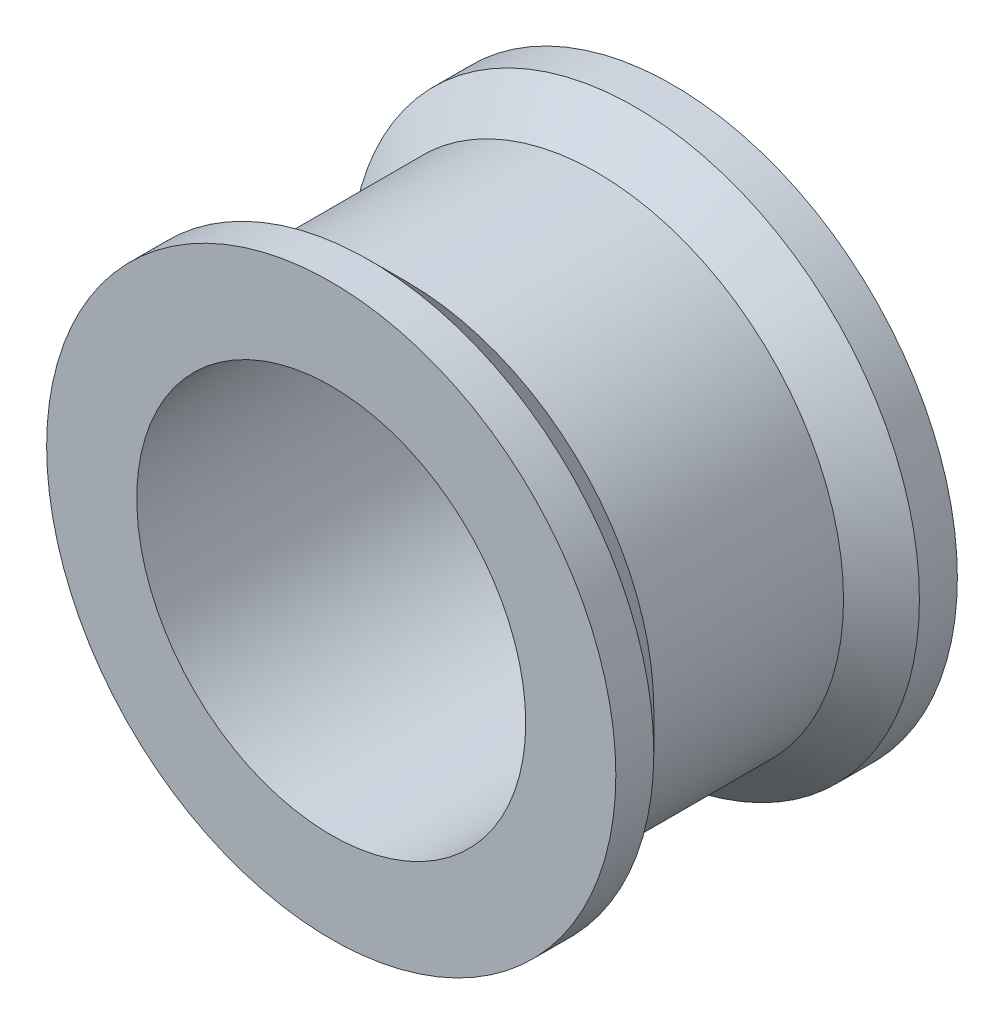
ISO-10303-21;
HEADER;
FILE_DESCRIPTION(('STEP AP214'),'2;1');
FILE_NAME('part.step','',(''),(''),'','','');
FILE_SCHEMA(('AUTOMOTIVE_DESIGN { 1 0 10303 214 1 1 1 1 }'));
ENDSEC;
DATA;
#1=APPLICATION_CONTEXT('core data for automotive mechanical design processes');
#2=APPLICATION_PROTOCOL_DEFINITION('international standard','automotive_design',2000,#1);
#3=PRODUCT_CONTEXT('',#1,'mechanical');
#4=PRODUCT('Part','Part','',(#3));
#5=PRODUCT_RELATED_PRODUCT_CATEGORY('part','',(#4));
#6=PRODUCT_DEFINITION_FORMATION('','',#4);
#7=PRODUCT_DEFINITION_CONTEXT('part definition',#1,'design');
#8=PRODUCT_DEFINITION('design','',#6,#7);
#9=PRODUCT_DEFINITION_SHAPE('','',#8);
#10=(LENGTH_UNIT() NAMED_UNIT(*) SI_UNIT(.MILLI.,.METRE.));
#11=(NAMED_UNIT(*) PLANE_ANGLE_UNIT() SI_UNIT($,.RADIAN.));
#12=(NAMED_UNIT(*) SI_UNIT($,.STERADIAN.) SOLID_ANGLE_UNIT());
#13=UNCERTAINTY_MEASURE_WITH_UNIT(LENGTH_MEASURE(1.E-05),#10,'distance_accuracy_value','');
#14=(GEOMETRIC_REPRESENTATION_CONTEXT(3) GLOBAL_UNCERTAINTY_ASSIGNED_CONTEXT((#13)) GLOBAL_UNIT_ASSIGNED_CONTEXT((#10,
#11,#12)) REPRESENTATION_CONTEXT('',''));
#15=CARTESIAN_POINT('',(0.,0.,0.));
#16=DIRECTION('',(0.,0.,1.));
#17=DIRECTION('',(1.,0.,0.));
#18=AXIS2_PLACEMENT_3D('',#15,#16,#17);
#19=CARTESIAN_POINT('',(0.,0.,0.));
#20=DIRECTION('',(0.,0.,1.));
#21=DIRECTION('',(1.,0.,0.));
#22=AXIS2_PLACEMENT_3D('',#19,#20,#21);
#23=PLANE('',#22);
#24=CARTESIAN_POINT('',(0.,0.,0.));
#25=DIRECTION('',(0.,0.,1.));
#26=DIRECTION('',(1.,0.,0.));
#27=AXIS2_PLACEMENT_3D('',#24,#25,#26);
#28=CIRCLE('',#27,7.5);
#29=CARTESIAN_POINT('',(7.5,0.,0.));
#30=VERTEX_POINT('',#29);
#31=EDGE_CURVE('E42',#30,#30,#28,.T.);
#32=ORIENTED_EDGE('',*,*,#31,.F.);
#33=EDGE_LOOP('',(#32));
#34=FACE_BOUND('',#33,.T.);
#35=CARTESIAN_POINT('',(0.,0.,0.));
#36=DIRECTION('',(0.,0.,1.));
#37=DIRECTION('',(1.,0.,0.));
#38=AXIS2_PLACEMENT_3D('',#35,#36,#37);
#39=CIRCLE('',#38,5.125);
#40=CARTESIAN_POINT('',(5.125,0.,0.));
#41=VERTEX_POINT('',#40);
#42=EDGE_CURVE('E47',#41,#41,#39,.T.);
#43=ORIENTED_EDGE('',*,*,#42,.T.);
#44=EDGE_LOOP('',(#43));
#45=FACE_BOUND('',#44,.T.);
#46=ADVANCED_FACE('F31',(#34,#45),#23,.F.);
#47=CARTESIAN_POINT('',(0.,0.,1.));
#48=DIRECTION('',(0.,0.,-1.));
#49=DIRECTION('',(-1.,0.,0.));
#50=AXIS2_PLACEMENT_3D('',#47,#48,#49);
#51=CYLINDRICAL_SURFACE('',#50,7.5);
#52=CARTESIAN_POINT('',(0.,0.,1.));
#53=DIRECTION('',(0.,0.,1.));
#54=DIRECTION('',(1.,0.,0.));
#55=AXIS2_PLACEMENT_3D('',#52,#53,#54);
#56=CIRCLE('',#55,7.5);
#57=CARTESIAN_POINT('',(7.5,0.,1.));
#58=VERTEX_POINT('',#57);
#59=EDGE_CURVE('E38',#58,#58,#56,.T.);
#60=ORIENTED_EDGE('',*,*,#59,.F.);
#61=EDGE_LOOP('',(#60));
#62=FACE_BOUND('',#61,.T.);
#63=ORIENTED_EDGE('',*,*,#31,.T.);
#64=EDGE_LOOP('',(#63));
#65=FACE_BOUND('',#64,.T.);
#66=ADVANCED_FACE('F80',(#62,#65),#51,.T.);
#67=CARTESIAN_POINT('',(0.,0.,1.));
#68=DIRECTION('',(0.,0.,-1.));
#69=DIRECTION('',(-1.,0.,0.));
#70=AXIS2_PLACEMENT_3D('',#67,#68,#69);
#71=CYLINDRICAL_SURFACE('',#70,5.125);
#72=ORIENTED_EDGE('',*,*,#42,.F.);
#73=EDGE_LOOP('',(#72));
#74=FACE_BOUND('',#73,.T.);
#75=CARTESIAN_POINT('',(0.,0.,9.));
#76=DIRECTION('',(0.,0.,1.));
#77=DIRECTION('',(1.,0.,0.));
#78=AXIS2_PLACEMENT_3D('',#75,#76,#77);
#79=CIRCLE('',#78,5.125);
#80=CARTESIAN_POINT('',(5.125,0.,9.));
#81=VERTEX_POINT('',#80);
#82=EDGE_CURVE('E58',#81,#81,#79,.T.);
#83=ORIENTED_EDGE('',*,*,#82,.T.);
#84=EDGE_LOOP('',(#83));
#85=FACE_BOUND('',#84,.T.);
#86=ADVANCED_FACE('F64',(#74,#85),#71,.F.);
#87=CARTESIAN_POINT('',(0.,0.,4.5));
#88=DIRECTION('',(0.,0.,-1.));
#89=DIRECTION('',(-1.,0.,0.));
#90=AXIS2_PLACEMENT_3D('',#87,#88,#89);
#91=CYLINDRICAL_SURFACE('',#90,6.5);
#92=CARTESIAN_POINT('',(0.,0.,2.00000000000001));
#93=DIRECTION('',(0.,0.,1.));
#94=DIRECTION('',(1.,0.,0.));
#95=AXIS2_PLACEMENT_3D('',#92,#93,#94);
#96=CIRCLE('',#95,6.5);
#97=CARTESIAN_POINT('',(6.5,0.,2.00000000000001));
#98=VERTEX_POINT('',#97);
#99=EDGE_CURVE('E10',#98,#98,#96,.T.);
#100=ORIENTED_EDGE('',*,*,#99,.T.);
#101=EDGE_LOOP('',(#100));
#102=FACE_BOUND('',#101,.T.);
#103=CARTESIAN_POINT('',(0.,0.,6.99999999999999));
#104=DIRECTION('',(0.,0.,1.));
#105=DIRECTION('',(1.,0.,0.));
#106=AXIS2_PLACEMENT_3D('',#103,#104,#105);
#107=CIRCLE('',#106,6.5);
#108=CARTESIAN_POINT('',(6.5,0.,6.99999999999999));
#109=VERTEX_POINT('',#108);
#110=EDGE_CURVE('E51',#109,#109,#107,.T.);
#111=ORIENTED_EDGE('',*,*,#110,.F.);
#112=EDGE_LOOP('',(#111));
#113=FACE_BOUND('',#112,.T.);
#114=ADVANCED_FACE('F78',(#102,#113),#91,.T.);
#115=CARTESIAN_POINT('',(0.,0.,2.00000000000001));
#116=DIRECTION('',(0.,0.,-1.));
#117=DIRECTION('',(-1.,0.,0.));
#118=AXIS2_PLACEMENT_3D('',#115,#116,#117);
#119=CONICAL_SURFACE('',#118,6.5,0.785398163397444);
#120=ORIENTED_EDGE('',*,*,#59,.T.);
#121=EDGE_LOOP('',(#120));
#122=FACE_BOUND('',#121,.T.);
#123=ORIENTED_EDGE('',*,*,#99,.F.);
#124=EDGE_LOOP('',(#123));
#125=FACE_BOUND('',#124,.T.);
#126=ADVANCED_FACE('F33',(#122,#125),#119,.T.);
#127=CARTESIAN_POINT('',(0.,0.,9.));
#128=DIRECTION('',(0.,0.,-1.));
#129=DIRECTION('',(1.,0.,0.));
#130=AXIS2_PLACEMENT_3D('',#127,#128,#129);
#131=PLANE('',#130);
#132=CARTESIAN_POINT('',(0.,0.,9.));
#133=DIRECTION('',(0.,0.,1.));
#134=DIRECTION('',(1.,0.,0.));
#135=AXIS2_PLACEMENT_3D('',#132,#133,#134);
#136=CIRCLE('',#135,7.5);
#137=CARTESIAN_POINT('',(7.5,0.,9.));
#138=VERTEX_POINT('',#137);
#139=EDGE_CURVE('E55',#138,#138,#136,.T.);
#140=ORIENTED_EDGE('',*,*,#139,.T.);
#141=EDGE_LOOP('',(#140));
#142=FACE_BOUND('',#141,.T.);
#143=ORIENTED_EDGE('',*,*,#82,.F.);
#144=EDGE_LOOP('',(#143));
#145=FACE_BOUND('',#144,.T.);
#146=ADVANCED_FACE('F66',(#142,#145),#131,.F.);
#147=CARTESIAN_POINT('',(0.,0.,8.));
#148=DIRECTION('',(0.,0.,1.));
#149=DIRECTION('',(-1.,0.,0.));
#150=AXIS2_PLACEMENT_3D('',#147,#148,#149);
#151=CYLINDRICAL_SURFACE('',#150,7.5);
#152=CARTESIAN_POINT('',(0.,0.,8.));
#153=DIRECTION('',(0.,0.,1.));
#154=DIRECTION('',(1.,0.,0.));
#155=AXIS2_PLACEMENT_3D('',#152,#153,#154);
#156=CIRCLE('',#155,7.5);
#157=CARTESIAN_POINT('',(7.5,0.,8.));
#158=VERTEX_POINT('',#157);
#159=EDGE_CURVE('E54',#158,#158,#156,.T.);
#160=ORIENTED_EDGE('',*,*,#159,.T.);
#161=EDGE_LOOP('',(#160));
#162=FACE_BOUND('',#161,.T.);
#163=ORIENTED_EDGE('',*,*,#139,.F.);
#164=EDGE_LOOP('',(#163));
#165=FACE_BOUND('',#164,.T.);
#166=ADVANCED_FACE('F68',(#162,#165),#151,.T.);
#167=CARTESIAN_POINT('',(0.,0.,6.99999999999999));
#168=DIRECTION('',(0.,0.,1.));
#169=DIRECTION('',(-1.,0.,0.));
#170=AXIS2_PLACEMENT_3D('',#167,#168,#169);
#171=CONICAL_SURFACE('',#170,6.5,0.785398163397444);
#172=ORIENTED_EDGE('',*,*,#159,.F.);
#173=EDGE_LOOP('',(#172));
#174=FACE_BOUND('',#173,.T.);
#175=ORIENTED_EDGE('',*,*,#110,.T.);
#176=EDGE_LOOP('',(#175));
#177=FACE_BOUND('',#176,.T.);
#178=ADVANCED_FACE('F75',(#174,#177),#171,.T.);
#179=CLOSED_SHELL('',(#46,#66,#86,#114,#126,#146,#166,#178));
#180=MANIFOLD_SOLID_BREP('B2',#179);
#181=ADVANCED_BREP_SHAPE_REPRESENTATION('',(#18,#180),#14);
#182=SHAPE_DEFINITION_REPRESENTATION(#9,#181);
ENDSEC;
END-ISO-10303-21;
